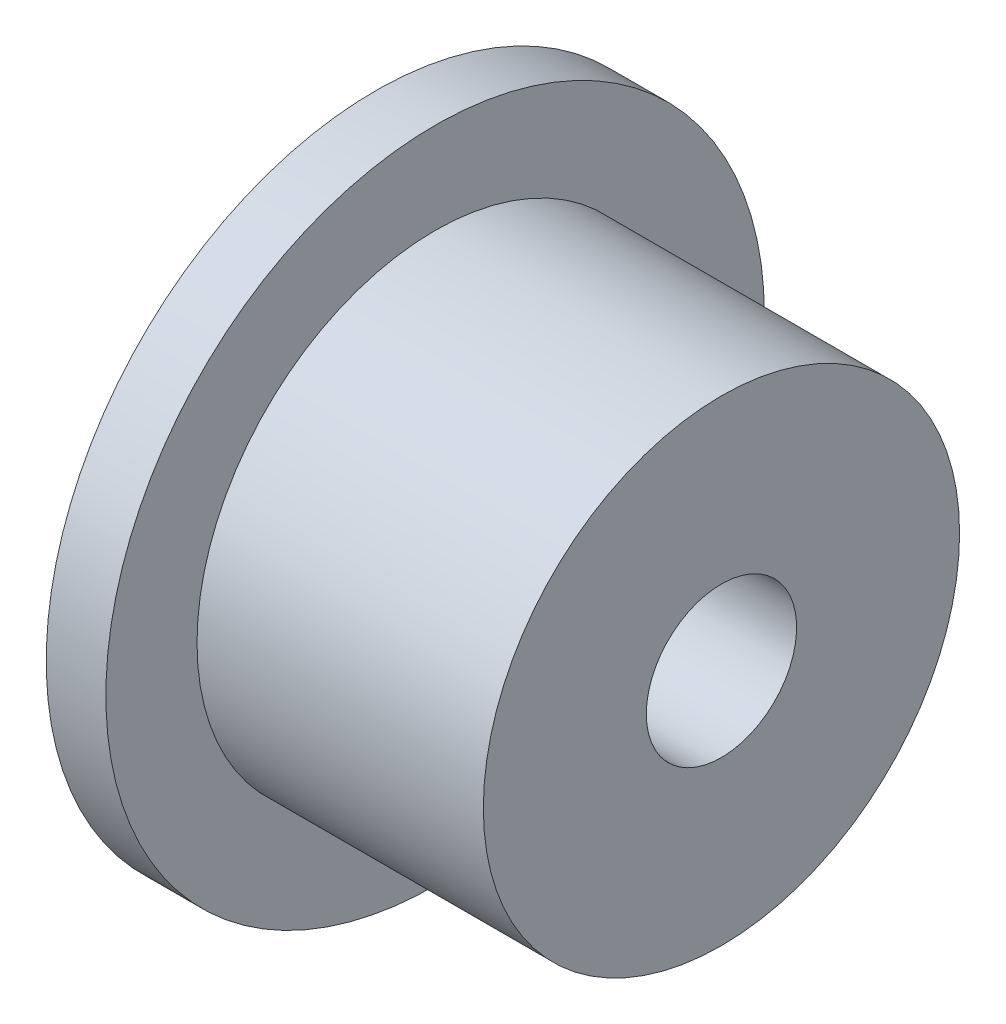
ISO-10303-21;
HEADER;
FILE_DESCRIPTION(('STEP AP214'),'2;1');
FILE_NAME('part.step','',(''),(''),'','','');
FILE_SCHEMA(('AUTOMOTIVE_DESIGN { 1 0 10303 214 1 1 1 1 }'));
ENDSEC;
DATA;
#1=APPLICATION_CONTEXT('core data for automotive mechanical design processes');
#2=APPLICATION_PROTOCOL_DEFINITION('international standard','automotive_design',2000,#1);
#3=PRODUCT_CONTEXT('',#1,'mechanical');
#4=PRODUCT('Part','Part','',(#3));
#5=PRODUCT_RELATED_PRODUCT_CATEGORY('part','',(#4));
#6=PRODUCT_DEFINITION_FORMATION('','',#4);
#7=PRODUCT_DEFINITION_CONTEXT('part definition',#1,'design');
#8=PRODUCT_DEFINITION('design','',#6,#7);
#9=PRODUCT_DEFINITION_SHAPE('','',#8);
#10=(LENGTH_UNIT() NAMED_UNIT(*) SI_UNIT(.MILLI.,.METRE.));
#11=(NAMED_UNIT(*) PLANE_ANGLE_UNIT() SI_UNIT($,.RADIAN.));
#12=(NAMED_UNIT(*) SI_UNIT($,.STERADIAN.) SOLID_ANGLE_UNIT());
#13=UNCERTAINTY_MEASURE_WITH_UNIT(LENGTH_MEASURE(1.E-05),#10,'distance_accuracy_value','');
#14=(GEOMETRIC_REPRESENTATION_CONTEXT(3) GLOBAL_UNCERTAINTY_ASSIGNED_CONTEXT((#13)) GLOBAL_UNIT_ASSIGNED_CONTEXT((#10,
#11,#12)) REPRESENTATION_CONTEXT('',''));
#15=CARTESIAN_POINT('',(0.,0.,0.));
#16=DIRECTION('',(0.,0.,1.));
#17=DIRECTION('',(1.,0.,0.));
#18=AXIS2_PLACEMENT_3D('',#15,#16,#17);
#19=CARTESIAN_POINT('',(23.5204,0.,0.));
#20=DIRECTION('',(1.,0.,0.));
#21=DIRECTION('',(0.,0.,-1.));
#22=AXIS2_PLACEMENT_3D('',#19,#20,#21);
#23=CYLINDRICAL_SURFACE('',#22,6.35);
#24=CARTESIAN_POINT('',(5.1054,0.,0.));
#25=DIRECTION('',(1.,0.,0.));
#26=DIRECTION('',(0.,0.,-1.));
#27=AXIS2_PLACEMENT_3D('',#24,#25,#26);
#28=CIRCLE('',#27,6.35);
#29=CARTESIAN_POINT('',(5.1054,0.,-6.35));
#30=VERTEX_POINT('',#29);
#31=EDGE_CURVE('E10',#30,#30,#28,.T.);
#32=ORIENTED_EDGE('',*,*,#31,.F.);
#33=EDGE_LOOP('',(#32));
#34=FACE_BOUND('',#33,.T.);
#35=CARTESIAN_POINT('',(-0.68072,0.,0.));
#36=DIRECTION('',(-1.,0.,0.));
#37=DIRECTION('',(0.,0.,1.));
#38=AXIS2_PLACEMENT_3D('',#35,#36,#37);
#39=CIRCLE('',#38,6.35);
#40=CARTESIAN_POINT('',(-0.68072,0.,6.35));
#41=VERTEX_POINT('',#40);
#42=EDGE_CURVE('E56',#41,#41,#39,.T.);
#43=ORIENTED_EDGE('',*,*,#42,.F.);
#44=EDGE_LOOP('',(#43));
#45=FACE_BOUND('',#44,.T.);
#46=ADVANCED_FACE('F31',(#34,#45),#23,.T.);
#47=CARTESIAN_POINT('',(5.1054,6.35,0.));
#48=DIRECTION('',(-1.,0.,0.));
#49=DIRECTION('',(0.,0.,1.));
#50=AXIS2_PLACEMENT_3D('',#47,#48,#49);
#51=PLANE('',#50);
#52=ORIENTED_EDGE('',*,*,#31,.T.);
#53=EDGE_LOOP('',(#52));
#54=FACE_BOUND('',#53,.T.);
#55=CARTESIAN_POINT('',(5.1054,0.,0.));
#56=DIRECTION('',(1.,0.,0.));
#57=DIRECTION('',(0.,0.,-1.));
#58=AXIS2_PLACEMENT_3D('',#55,#56,#57);
#59=CIRCLE('',#58,17.526);
#60=CARTESIAN_POINT('',(5.1054,0.,-17.526));
#61=VERTEX_POINT('',#60);
#62=EDGE_CURVE('E37',#61,#61,#59,.T.);
#63=ORIENTED_EDGE('',*,*,#62,.F.);
#64=EDGE_LOOP('',(#63));
#65=FACE_BOUND('',#64,.T.);
#66=ADVANCED_FACE('F76',(#54,#65),#51,.T.);
#67=CARTESIAN_POINT('',(23.5204,0.,0.));
#68=DIRECTION('',(1.,0.,0.));
#69=DIRECTION('',(0.,0.,-1.));
#70=AXIS2_PLACEMENT_3D('',#67,#68,#69);
#71=CYLINDRICAL_SURFACE('',#70,17.526);
#72=ORIENTED_EDGE('',*,*,#62,.T.);
#73=EDGE_LOOP('',(#72));
#74=FACE_BOUND('',#73,.T.);
#75=CARTESIAN_POINT('',(8.2804,0.,0.));
#76=DIRECTION('',(1.,0.,0.));
#77=DIRECTION('',(0.,0.,-1.));
#78=AXIS2_PLACEMENT_3D('',#75,#76,#77);
#79=CIRCLE('',#78,17.526);
#80=CARTESIAN_POINT('',(8.2804,0.,-17.526));
#81=VERTEX_POINT('',#80);
#82=EDGE_CURVE('E41',#81,#81,#79,.T.);
#83=ORIENTED_EDGE('',*,*,#82,.F.);
#84=EDGE_LOOP('',(#83));
#85=FACE_BOUND('',#84,.T.);
#86=ADVANCED_FACE('F81',(#74,#85),#71,.T.);
#87=CARTESIAN_POINT('',(8.2804,17.526,0.));
#88=DIRECTION('',(1.,0.,0.));
#89=DIRECTION('',(0.,0.,-1.));
#90=AXIS2_PLACEMENT_3D('',#87,#88,#89);
#91=PLANE('',#90);
#92=ORIENTED_EDGE('',*,*,#82,.T.);
#93=EDGE_LOOP('',(#92));
#94=FACE_BOUND('',#93,.T.);
#95=CARTESIAN_POINT('',(8.2804,0.,0.));
#96=DIRECTION('',(1.,0.,0.));
#97=DIRECTION('',(0.,0.,-1.));
#98=AXIS2_PLACEMENT_3D('',#95,#96,#97);
#99=CIRCLE('',#98,12.6746);
#100=CARTESIAN_POINT('',(8.2804,0.,-12.6746));
#101=VERTEX_POINT('',#100);
#102=EDGE_CURVE('E45',#101,#101,#99,.T.);
#103=ORIENTED_EDGE('',*,*,#102,.F.);
#104=EDGE_LOOP('',(#103));
#105=FACE_BOUND('',#104,.T.);
#106=ADVANCED_FACE('F87',(#94,#105),#91,.T.);
#107=CARTESIAN_POINT('',(23.5204,0.,0.));
#108=DIRECTION('',(1.,0.,0.));
#109=DIRECTION('',(0.,0.,-1.));
#110=AXIS2_PLACEMENT_3D('',#107,#108,#109);
#111=CYLINDRICAL_SURFACE('',#110,12.6746);
#112=ORIENTED_EDGE('',*,*,#102,.T.);
#113=EDGE_LOOP('',(#112));
#114=FACE_BOUND('',#113,.T.);
#115=CARTESIAN_POINT('',(23.5204,0.,0.));
#116=DIRECTION('',(1.,0.,0.));
#117=DIRECTION('',(0.,0.,-1.));
#118=AXIS2_PLACEMENT_3D('',#115,#116,#117);
#119=CIRCLE('',#118,12.6746);
#120=CARTESIAN_POINT('',(23.5204,0.,-12.6746));
#121=VERTEX_POINT('',#120);
#122=EDGE_CURVE('E50',#121,#121,#119,.T.);
#123=ORIENTED_EDGE('',*,*,#122,.F.);
#124=EDGE_LOOP('',(#123));
#125=FACE_BOUND('',#124,.T.);
#126=ADVANCED_FACE('F93',(#114,#125),#111,.T.);
#127=CARTESIAN_POINT('',(23.5204,12.6746,0.));
#128=DIRECTION('',(1.,0.,0.));
#129=DIRECTION('',(0.,0.,-1.));
#130=AXIS2_PLACEMENT_3D('',#127,#128,#129);
#131=PLANE('',#130);
#132=CARTESIAN_POINT('',(23.5204,0.,0.));
#133=DIRECTION('',(-1.,0.,0.));
#134=DIRECTION('',(0.,0.,1.));
#135=AXIS2_PLACEMENT_3D('',#132,#133,#134);
#136=CIRCLE('',#135,4.0005);
#137=CARTESIAN_POINT('',(23.5204,0.,4.0005));
#138=VERTEX_POINT('',#137);
#139=EDGE_CURVE('E53',#138,#138,#136,.T.);
#140=ORIENTED_EDGE('',*,*,#139,.T.);
#141=EDGE_LOOP('',(#140));
#142=FACE_BOUND('',#141,.T.);
#143=ORIENTED_EDGE('',*,*,#122,.T.);
#144=EDGE_LOOP('',(#143));
#145=FACE_BOUND('',#144,.T.);
#146=ADVANCED_FACE('F72',(#142,#145),#131,.T.);
#147=CARTESIAN_POINT('',(23.5204,0.,0.));
#148=DIRECTION('',(-1.,0.,0.));
#149=DIRECTION('',(0.,0.,1.));
#150=AXIS2_PLACEMENT_3D('',#147,#148,#149);
#151=CYLINDRICAL_SURFACE('',#150,4.0005);
#152=ORIENTED_EDGE('',*,*,#139,.F.);
#153=EDGE_LOOP('',(#152));
#154=FACE_BOUND('',#153,.T.);
#155=CARTESIAN_POINT('',(-0.68072,0.,0.));
#156=DIRECTION('',(-1.,0.,0.));
#157=DIRECTION('',(0.,0.,1.));
#158=AXIS2_PLACEMENT_3D('',#155,#156,#157);
#159=CIRCLE('',#158,4.0005);
#160=CARTESIAN_POINT('',(-0.68072,0.,4.0005));
#161=VERTEX_POINT('',#160);
#162=EDGE_CURVE('E59',#161,#161,#159,.T.);
#163=ORIENTED_EDGE('',*,*,#162,.T.);
#164=EDGE_LOOP('',(#163));
#165=FACE_BOUND('',#164,.T.);
#166=ADVANCED_FACE('F63',(#154,#165),#151,.F.);
#167=CARTESIAN_POINT('',(-0.68072,0.,0.));
#168=DIRECTION('',(-1.,0.,0.));
#169=DIRECTION('',(0.,0.,1.));
#170=AXIS2_PLACEMENT_3D('',#167,#168,#169);
#171=PLANE('',#170);
#172=ORIENTED_EDGE('',*,*,#42,.T.);
#173=EDGE_LOOP('',(#172));
#174=FACE_BOUND('',#173,.T.);
#175=ORIENTED_EDGE('',*,*,#162,.F.);
#176=EDGE_LOOP('',(#175));
#177=FACE_BOUND('',#176,.T.);
#178=ADVANCED_FACE('F65',(#174,#177),#171,.T.);
#179=CLOSED_SHELL('',(#46,#66,#86,#106,#126,#146,#166,#178));
#180=MANIFOLD_SOLID_BREP('B2',#179);
#181=ADVANCED_BREP_SHAPE_REPRESENTATION('',(#18,#180),#14);
#182=SHAPE_DEFINITION_REPRESENTATION(#9,#181);
ENDSEC;
END-ISO-10303-21;
